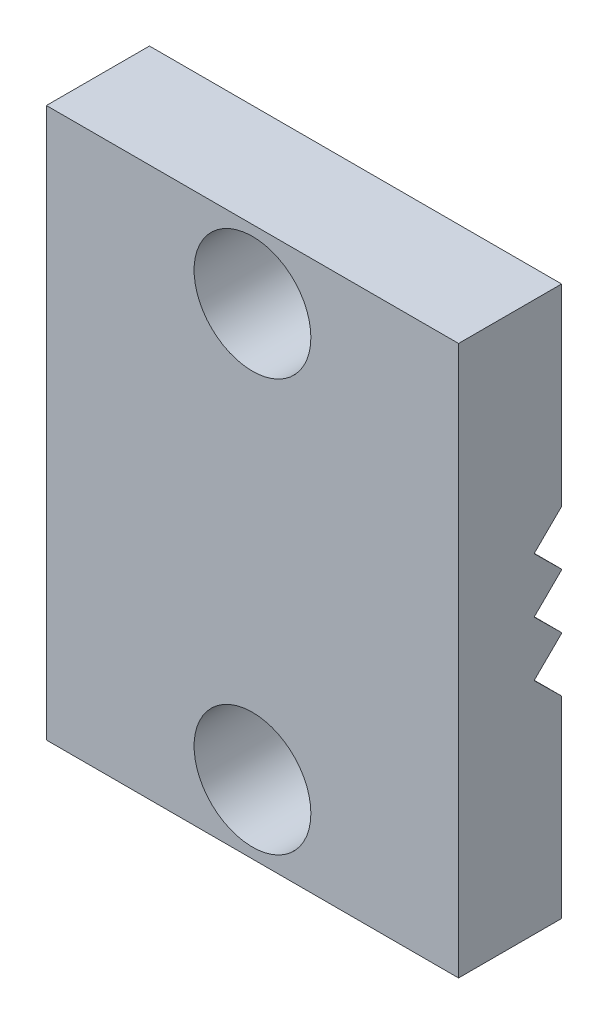
ISO-10303-21;
HEADER;
FILE_DESCRIPTION(('STEP AP214'),'2;1');
FILE_NAME('part.step','',(''),(''),'','','');
FILE_SCHEMA(('AUTOMOTIVE_DESIGN { 1 0 10303 214 1 1 1 1 }'));
ENDSEC;
DATA;
#1=APPLICATION_CONTEXT('core data for automotive mechanical design processes');
#2=APPLICATION_PROTOCOL_DEFINITION('international standard','automotive_design',2000,#1);
#3=PRODUCT_CONTEXT('',#1,'mechanical');
#4=PRODUCT('Part','Part','',(#3));
#5=PRODUCT_RELATED_PRODUCT_CATEGORY('part','',(#4));
#6=PRODUCT_DEFINITION_FORMATION('','',#4);
#7=PRODUCT_DEFINITION_CONTEXT('part definition',#1,'design');
#8=PRODUCT_DEFINITION('design','',#6,#7);
#9=PRODUCT_DEFINITION_SHAPE('','',#8);
#10=(LENGTH_UNIT() NAMED_UNIT(*) SI_UNIT(.MILLI.,.METRE.));
#11=(NAMED_UNIT(*) PLANE_ANGLE_UNIT() SI_UNIT($,.RADIAN.));
#12=(NAMED_UNIT(*) SI_UNIT($,.STERADIAN.) SOLID_ANGLE_UNIT());
#13=UNCERTAINTY_MEASURE_WITH_UNIT(LENGTH_MEASURE(1.E-05),#10,'distance_accuracy_value','');
#14=(GEOMETRIC_REPRESENTATION_CONTEXT(3) GLOBAL_UNCERTAINTY_ASSIGNED_CONTEXT((#13)) GLOBAL_UNIT_ASSIGNED_CONTEXT((#10,
#11,#12)) REPRESENTATION_CONTEXT('',''));
#15=CARTESIAN_POINT('',(0.,0.,0.));
#16=DIRECTION('',(0.,0.,1.));
#17=DIRECTION('',(1.,0.,0.));
#18=AXIS2_PLACEMENT_3D('',#15,#16,#17);
#19=CARTESIAN_POINT('',(40.,27.,125.));
#20=DIRECTION('',(0.,0.,1.));
#21=DIRECTION('',(1.,0.,0.));
#22=AXIS2_PLACEMENT_3D('',#19,#20,#21);
#23=CYLINDRICAL_SURFACE('',#22,1.7);
#24=DIRECTION('',(0.,0.,1.));
#25=VECTOR('',#24,1.);
#26=CARTESIAN_POINT('',(41.7,27.,125.));
#27=LINE('',#26,#25);
#28=CARTESIAN_POINT('',(41.7,27.,126.));
#29=VERTEX_POINT('',#28);
#30=CARTESIAN_POINT('',(41.7,27.,129.));
#31=VERTEX_POINT('',#30);
#32=EDGE_CURVE('E11',#29,#31,#27,.T.);
#33=ORIENTED_EDGE('',*,*,#32,.F.);
#34=CARTESIAN_POINT('',(40.,27.,126.));
#35=DIRECTION('',(0.,0.,1.));
#36=DIRECTION('',(1.,0.,0.));
#37=AXIS2_PLACEMENT_3D('',#34,#35,#36);
#38=CIRCLE('',#37,1.7);
#39=EDGE_CURVE('E101',#29,#29,#38,.T.);
#40=ORIENTED_EDGE('',*,*,#39,.F.);
#41=ORIENTED_EDGE('',*,*,#32,.T.);
#42=CARTESIAN_POINT('',(40.,27.,129.));
#43=DIRECTION('',(0.,0.,1.));
#44=DIRECTION('',(1.,0.,0.));
#45=AXIS2_PLACEMENT_3D('',#42,#43,#44);
#46=CIRCLE('',#45,1.7);
#47=EDGE_CURVE('E82',#31,#31,#46,.T.);
#48=ORIENTED_EDGE('',*,*,#47,.T.);
#49=EDGE_LOOP('',(#33,#40,#41,#48));
#50=FACE_BOUND('',#49,.T.);
#51=ADVANCED_FACE('F17',(#50),#23,.F.);
#52=CARTESIAN_POINT('',(40.,39.,125.));
#53=DIRECTION('',(0.,0.,1.));
#54=DIRECTION('',(1.,0.,0.));
#55=AXIS2_PLACEMENT_3D('',#52,#53,#54);
#56=CYLINDRICAL_SURFACE('',#55,1.7);
#57=DIRECTION('',(0.,0.,1.));
#58=VECTOR('',#57,1.);
#59=CARTESIAN_POINT('',(41.7,39.,125.));
#60=LINE('',#59,#58);
#61=CARTESIAN_POINT('',(41.7,39.,126.));
#62=VERTEX_POINT('',#61);
#63=CARTESIAN_POINT('',(41.7,39.,129.));
#64=VERTEX_POINT('',#63);
#65=EDGE_CURVE('E26',#62,#64,#60,.T.);
#66=ORIENTED_EDGE('',*,*,#65,.F.);
#67=CARTESIAN_POINT('',(40.,39.,126.));
#68=DIRECTION('',(0.,0.,1.));
#69=DIRECTION('',(1.,0.,0.));
#70=AXIS2_PLACEMENT_3D('',#67,#68,#69);
#71=CIRCLE('',#70,1.7);
#72=EDGE_CURVE('E190',#62,#62,#71,.T.);
#73=ORIENTED_EDGE('',*,*,#72,.F.);
#74=ORIENTED_EDGE('',*,*,#65,.T.);
#75=CARTESIAN_POINT('',(40.,39.,129.));
#76=DIRECTION('',(0.,0.,1.));
#77=DIRECTION('',(1.,0.,0.));
#78=AXIS2_PLACEMENT_3D('',#75,#76,#77);
#79=CIRCLE('',#78,1.7);
#80=EDGE_CURVE('E110',#64,#64,#79,.T.);
#81=ORIENTED_EDGE('',*,*,#80,.T.);
#82=EDGE_LOOP('',(#66,#73,#74,#81));
#83=FACE_BOUND('',#82,.T.);
#84=ADVANCED_FACE('F387',(#83),#56,.F.);
#85=CARTESIAN_POINT('',(46.,25.,126.));
#86=DIRECTION('',(1.,0.,0.));
#87=DIRECTION('',(0.,1.,0.));
#88=AXIS2_PLACEMENT_3D('',#85,#86,#87);
#89=PLANE('',#88);
#90=DIRECTION('',(0.,0.,1.));
#91=VECTOR('',#90,1.);
#92=CARTESIAN_POINT('',(46.,41.,126.));
#93=LINE('',#92,#91);
#94=CARTESIAN_POINT('',(46.,41.,126.));
#95=VERTEX_POINT('',#94);
#96=CARTESIAN_POINT('',(46.,41.,129.));
#97=VERTEX_POINT('',#96);
#98=EDGE_CURVE('E77',#95,#97,#93,.T.);
#99=ORIENTED_EDGE('',*,*,#98,.T.);
#100=DIRECTION('',(0.,1.,0.));
#101=VECTOR('',#100,1.);
#102=CARTESIAN_POINT('',(46.,25.,129.));
#103=LINE('',#102,#101);
#104=CARTESIAN_POINT('',(46.,25.,129.));
#105=VERTEX_POINT('',#104);
#106=EDGE_CURVE('E67',#105,#97,#103,.T.);
#107=ORIENTED_EDGE('',*,*,#106,.F.);
#108=DIRECTION('',(0.,0.,1.));
#109=VECTOR('',#108,1.);
#110=CARTESIAN_POINT('',(46.,25.,126.));
#111=LINE('',#110,#109);
#112=CARTESIAN_POINT('',(46.,25.,126.));
#113=VERTEX_POINT('',#112);
#114=EDGE_CURVE('E72',#113,#105,#111,.T.);
#115=ORIENTED_EDGE('',*,*,#114,.F.);
#116=DIRECTION('',(0.,1.,0.));
#117=VECTOR('',#116,1.);
#118=CARTESIAN_POINT('',(46.,25.,126.));
#119=LINE('',#118,#117);
#120=CARTESIAN_POINT('',(46.,30.60987654321,126.));
#121=VERTEX_POINT('',#120);
#122=EDGE_CURVE('E123',#113,#121,#119,.T.);
#123=ORIENTED_EDGE('',*,*,#122,.T.);
#124=DIRECTION('',(0.,-0.702701259061299,-0.711485024799303));
#125=VECTOR('',#124,1.);
#126=CARTESIAN_POINT('',(46.,29.219890440552,124.59263907105));
#127=LINE('',#126,#125);
#128=CARTESIAN_POINT('',(46.,31.4,126.8));
#129=VERTEX_POINT('',#128);
#130=EDGE_CURVE('E131',#129,#121,#127,.T.);
#131=ORIENTED_EDGE('',*,*,#130,.F.);
#132=DIRECTION('',(0.,-0.702701259061299,0.711485024799303));
#133=VECTOR('',#132,1.);
#134=CARTESIAN_POINT('',(46.,30.019859578736,128.19739217653));
#135=LINE('',#134,#133);
#136=CARTESIAN_POINT('',(46.,32.19012345679,126.));
#137=VERTEX_POINT('',#136);
#138=EDGE_CURVE('E141',#137,#129,#135,.T.);
#139=ORIENTED_EDGE('',*,*,#138,.F.);
#140=DIRECTION('',(0.,1.,0.));
#141=VECTOR('',#140,1.);
#142=CARTESIAN_POINT('',(46.,25.,126.));
#143=LINE('',#142,#141);
#144=CARTESIAN_POINT('',(46.,32.20987654321,126.));
#145=VERTEX_POINT('',#144);
#146=EDGE_CURVE('E152',#137,#145,#143,.T.);
#147=ORIENTED_EDGE('',*,*,#146,.T.);
#148=DIRECTION('',(0.,-0.702701259061299,-0.711485024799303));
#149=VECTOR('',#148,1.);
#150=CARTESIAN_POINT('',(46.,30.424859192964,124.19266993287));
#151=LINE('',#150,#149);
#152=CARTESIAN_POINT('',(46.,33.,126.8));
#153=VERTEX_POINT('',#152);
#154=EDGE_CURVE('E160',#153,#145,#151,.T.);
#155=ORIENTED_EDGE('',*,*,#154,.F.);
#156=DIRECTION('',(0.,-0.702701259061299,0.711485024799303));
#157=VECTOR('',#156,1.);
#158=CARTESIAN_POINT('',(46.,31.224828331147,128.59736131471));
#159=LINE('',#158,#157);
#160=CARTESIAN_POINT('',(46.,33.79012345679,126.));
#161=VERTEX_POINT('',#160);
#162=EDGE_CURVE('E168',#161,#153,#159,.T.);
#163=ORIENTED_EDGE('',*,*,#162,.F.);
#164=DIRECTION('',(0.,1.,0.));
#165=VECTOR('',#164,1.);
#166=CARTESIAN_POINT('',(46.,25.,126.));
#167=LINE('',#166,#165);
#168=CARTESIAN_POINT('',(46.,33.80987654321,126.));
#169=VERTEX_POINT('',#168);
#170=EDGE_CURVE('E176',#161,#169,#167,.T.);
#171=ORIENTED_EDGE('',*,*,#170,.T.);
#172=DIRECTION('',(0.,-0.702701259061299,-0.711485024799303));
#173=VECTOR('',#172,1.);
#174=CARTESIAN_POINT('',(46.,31.629827945375,123.79270079469));
#175=LINE('',#174,#173);
#176=CARTESIAN_POINT('',(46.,34.6,126.8));
#177=VERTEX_POINT('',#176);
#178=EDGE_CURVE('E181',#177,#169,#175,.T.);
#179=ORIENTED_EDGE('',*,*,#178,.F.);
#180=DIRECTION('',(0.,-0.702701259061299,0.711485024799303));
#181=VECTOR('',#180,1.);
#182=CARTESIAN_POINT('',(46.,32.429797083558,128.99733045289));
#183=LINE('',#182,#181);
#184=CARTESIAN_POINT('',(46.,35.39012345679,126.));
#185=VERTEX_POINT('',#184);
#186=EDGE_CURVE('E189',#185,#177,#183,.T.);
#187=ORIENTED_EDGE('',*,*,#186,.F.);
#188=DIRECTION('',(0.,1.,0.));
#189=VECTOR('',#188,1.);
#190=CARTESIAN_POINT('',(46.,25.,126.));
#191=LINE('',#190,#189);
#192=EDGE_CURVE('E198',#185,#95,#191,.T.);
#193=ORIENTED_EDGE('',*,*,#192,.T.);
#194=EDGE_LOOP('',(#99,#107,#115,#123,#131,#139,#147,#155,#163,#171,#179,#187,#193));
#195=FACE_BOUND('',#194,.T.);
#196=ADVANCED_FACE('F69',(#195),#89,.T.);
#197=CARTESIAN_POINT('',(34.,25.,129.));
#198=DIRECTION('',(0.,0.,1.));
#199=DIRECTION('',(1.,0.,0.));
#200=AXIS2_PLACEMENT_3D('',#197,#198,#199);
#201=PLANE('',#200);
#202=ORIENTED_EDGE('',*,*,#80,.F.);
#203=EDGE_LOOP('',(#202));
#204=FACE_BOUND('',#203,.T.);
#205=ORIENTED_EDGE('',*,*,#47,.F.);
#206=EDGE_LOOP('',(#205));
#207=FACE_BOUND('',#206,.T.);
#208=DIRECTION('',(0.,1.,0.));
#209=VECTOR('',#208,1.);
#210=CARTESIAN_POINT('',(34.,25.,129.));
#211=LINE('',#210,#209);
#212=CARTESIAN_POINT('',(34.,25.,129.));
#213=VERTEX_POINT('',#212);
#214=CARTESIAN_POINT('',(34.,41.,129.));
#215=VERTEX_POINT('',#214);
#216=EDGE_CURVE('E90',#213,#215,#211,.T.);
#217=ORIENTED_EDGE('',*,*,#216,.F.);
#218=DIRECTION('',(1.,0.,0.));
#219=VECTOR('',#218,1.);
#220=CARTESIAN_POINT('',(34.,25.,129.));
#221=LINE('',#220,#219);
#222=EDGE_CURVE('E83',#213,#105,#221,.T.);
#223=ORIENTED_EDGE('',*,*,#222,.T.);
#224=ORIENTED_EDGE('',*,*,#106,.T.);
#225=DIRECTION('',(1.,0.,0.));
#226=VECTOR('',#225,1.);
#227=CARTESIAN_POINT('',(34.,41.,129.));
#228=LINE('',#227,#226);
#229=EDGE_CURVE('E200',#215,#97,#228,.T.);
#230=ORIENTED_EDGE('',*,*,#229,.F.);
#231=EDGE_LOOP('',(#217,#223,#224,#230));
#232=FACE_BOUND('',#231,.T.);
#233=ADVANCED_FACE('F87',(#204,#207,#232),#201,.T.);
#234=CARTESIAN_POINT('',(34.,25.,126.));
#235=DIRECTION('',(0.,1.,0.));
#236=DIRECTION('',(1.,0.,0.));
#237=AXIS2_PLACEMENT_3D('',#234,#235,#236);
#238=PLANE('',#237);
#239=ORIENTED_EDGE('',*,*,#114,.T.);
#240=ORIENTED_EDGE('',*,*,#222,.F.);
#241=DIRECTION('',(0.,0.,1.));
#242=VECTOR('',#241,1.);
#243=CARTESIAN_POINT('',(34.,25.,126.));
#244=LINE('',#243,#242);
#245=CARTESIAN_POINT('',(34.,25.,126.));
#246=VERTEX_POINT('',#245);
#247=EDGE_CURVE('E208',#246,#213,#244,.T.);
#248=ORIENTED_EDGE('',*,*,#247,.F.);
#249=DIRECTION('',(1.,0.,0.));
#250=VECTOR('',#249,1.);
#251=CARTESIAN_POINT('',(34.,25.,126.));
#252=LINE('',#251,#250);
#253=EDGE_CURVE('E98',#246,#113,#252,.T.);
#254=ORIENTED_EDGE('',*,*,#253,.T.);
#255=EDGE_LOOP('',(#239,#240,#248,#254));
#256=FACE_BOUND('',#255,.T.);
#257=ADVANCED_FACE('F96',(#256),#238,.F.);
#258=CARTESIAN_POINT('',(34.,25.,126.));
#259=DIRECTION('',(0.,0.,1.));
#260=DIRECTION('',(1.,0.,0.));
#261=AXIS2_PLACEMENT_3D('',#258,#259,#260);
#262=PLANE('',#261);
#263=ORIENTED_EDGE('',*,*,#39,.T.);
#264=EDGE_LOOP('',(#263));
#265=FACE_BOUND('',#264,.T.);
#266=DIRECTION('',(1.,0.,0.));
#267=VECTOR('',#266,1.);
#268=CARTESIAN_POINT('',(33.5,30.60987654321,126.));
#269=LINE('',#268,#267);
#270=CARTESIAN_POINT('',(34.,30.60987654321,126.));
#271=VERTEX_POINT('',#270);
#272=EDGE_CURVE('E126',#271,#121,#269,.T.);
#273=ORIENTED_EDGE('',*,*,#272,.T.);
#274=ORIENTED_EDGE('',*,*,#122,.F.);
#275=ORIENTED_EDGE('',*,*,#253,.F.);
#276=DIRECTION('',(0.,1.,0.));
#277=VECTOR('',#276,1.);
#278=CARTESIAN_POINT('',(34.,25.,126.));
#279=LINE('',#278,#277);
#280=EDGE_CURVE('E214',#246,#271,#279,.T.);
#281=ORIENTED_EDGE('',*,*,#280,.T.);
#282=EDGE_LOOP('',(#273,#274,#275,#281));
#283=FACE_BOUND('',#282,.T.);
#284=ADVANCED_FACE('F266',(#265,#283),#262,.F.);
#285=CARTESIAN_POINT('',(33.,30.6,125.99));
#286=DIRECTION('',(0.,-0.711485024799303,0.702701259061299));
#287=DIRECTION('',(-1.,0.,0.));
#288=AXIS2_PLACEMENT_3D('',#285,#286,#287);
#289=PLANE('',#288);
#290=ORIENTED_EDGE('',*,*,#130,.T.);
#291=ORIENTED_EDGE('',*,*,#272,.F.);
#292=DIRECTION('',(0.,-0.702701259061299,-0.711485024799303));
#293=VECTOR('',#292,1.);
#294=CARTESIAN_POINT('',(34.,29.219890440552,124.59263907105));
#295=LINE('',#294,#293);
#296=CARTESIAN_POINT('',(34.,31.4,126.8));
#297=VERTEX_POINT('',#296);
#298=EDGE_CURVE('E215',#297,#271,#295,.T.);
#299=ORIENTED_EDGE('',*,*,#298,.F.);
#300=DIRECTION('',(1.,0.,0.));
#301=VECTOR('',#300,1.);
#302=CARTESIAN_POINT('',(33.,31.4,126.8));
#303=LINE('',#302,#301);
#304=EDGE_CURVE('E138',#297,#129,#303,.T.);
#305=ORIENTED_EDGE('',*,*,#304,.T.);
#306=EDGE_LOOP('',(#290,#291,#299,#305));
#307=FACE_BOUND('',#306,.T.);
#308=ADVANCED_FACE('F278',(#307),#289,.F.);
#309=CARTESIAN_POINT('',(33.,31.4,126.8));
#310=DIRECTION('',(0.,0.711485024799303,0.702701259061299));
#311=DIRECTION('',(1.,0.,0.));
#312=AXIS2_PLACEMENT_3D('',#309,#310,#311);
#313=PLANE('',#312);
#314=DIRECTION('',(-1.,0.,0.));
#315=VECTOR('',#314,1.);
#316=CARTESIAN_POINT('',(33.5,32.19012345679,126.));
#317=LINE('',#316,#315);
#318=CARTESIAN_POINT('',(34.,32.19012345679,126.));
#319=VERTEX_POINT('',#318);
#320=EDGE_CURVE('E145',#137,#319,#317,.T.);
#321=ORIENTED_EDGE('',*,*,#320,.F.);
#322=ORIENTED_EDGE('',*,*,#138,.T.);
#323=ORIENTED_EDGE('',*,*,#304,.F.);
#324=DIRECTION('',(0.,-0.702701259061299,0.711485024799303));
#325=VECTOR('',#324,1.);
#326=CARTESIAN_POINT('',(34.,30.019859578736,128.19739217653));
#327=LINE('',#326,#325);
#328=EDGE_CURVE('E219',#319,#297,#327,.T.);
#329=ORIENTED_EDGE('',*,*,#328,.F.);
#330=EDGE_LOOP('',(#321,#322,#323,#329));
#331=FACE_BOUND('',#330,.T.);
#332=ADVANCED_FACE('F422',(#331),#313,.F.);
#333=CARTESIAN_POINT('',(34.,25.,126.));
#334=DIRECTION('',(0.,0.,1.));
#335=DIRECTION('',(1.,0.,0.));
#336=AXIS2_PLACEMENT_3D('',#333,#334,#335);
#337=PLANE('',#336);
#338=DIRECTION('',(1.,0.,0.));
#339=VECTOR('',#338,1.);
#340=CARTESIAN_POINT('',(33.5,32.20987654321,126.));
#341=LINE('',#340,#339);
#342=CARTESIAN_POINT('',(34.,32.20987654321,126.));
#343=VERTEX_POINT('',#342);
#344=EDGE_CURVE('E156',#343,#145,#341,.T.);
#345=ORIENTED_EDGE('',*,*,#344,.T.);
#346=ORIENTED_EDGE('',*,*,#146,.F.);
#347=ORIENTED_EDGE('',*,*,#320,.T.);
#348=DIRECTION('',(0.,1.,0.));
#349=VECTOR('',#348,1.);
#350=CARTESIAN_POINT('',(34.,25.,126.));
#351=LINE('',#350,#349);
#352=EDGE_CURVE('E225',#319,#343,#351,.T.);
#353=ORIENTED_EDGE('',*,*,#352,.T.);
#354=EDGE_LOOP('',(#345,#346,#347,#353));
#355=FACE_BOUND('',#354,.T.);
#356=ADVANCED_FACE('F372',(#355),#337,.F.);
#357=CARTESIAN_POINT('',(33.,32.2,125.99));
#358=DIRECTION('',(0.,-0.711485024799303,0.702701259061299));
#359=DIRECTION('',(-1.,0.,0.));
#360=AXIS2_PLACEMENT_3D('',#357,#358,#359);
#361=PLANE('',#360);
#362=ORIENTED_EDGE('',*,*,#154,.T.);
#363=ORIENTED_EDGE('',*,*,#344,.F.);
#364=DIRECTION('',(0.,-0.702701259061299,-0.711485024799303));
#365=VECTOR('',#364,1.);
#366=CARTESIAN_POINT('',(34.,30.424859192964,124.19266993287));
#367=LINE('',#366,#365);
#368=CARTESIAN_POINT('',(34.,33.,126.8));
#369=VERTEX_POINT('',#368);
#370=EDGE_CURVE('E235',#369,#343,#367,.T.);
#371=ORIENTED_EDGE('',*,*,#370,.F.);
#372=DIRECTION('',(1.,0.,0.));
#373=VECTOR('',#372,1.);
#374=CARTESIAN_POINT('',(33.,33.,126.8));
#375=LINE('',#374,#373);
#376=EDGE_CURVE('E164',#369,#153,#375,.T.);
#377=ORIENTED_EDGE('',*,*,#376,.T.);
#378=EDGE_LOOP('',(#362,#363,#371,#377));
#379=FACE_BOUND('',#378,.T.);
#380=ADVANCED_FACE('F369',(#379),#361,.F.);
#381=CARTESIAN_POINT('',(33.,33.,126.8));
#382=DIRECTION('',(0.,0.711485024799303,0.702701259061299));
#383=DIRECTION('',(1.,0.,0.));
#384=AXIS2_PLACEMENT_3D('',#381,#382,#383);
#385=PLANE('',#384);
#386=DIRECTION('',(-1.,0.,0.));
#387=VECTOR('',#386,1.);
#388=CARTESIAN_POINT('',(33.5,33.79012345679,126.));
#389=LINE('',#388,#387);
#390=CARTESIAN_POINT('',(34.,33.79012345679,126.));
#391=VERTEX_POINT('',#390);
#392=EDGE_CURVE('E172',#161,#391,#389,.T.);
#393=ORIENTED_EDGE('',*,*,#392,.F.);
#394=ORIENTED_EDGE('',*,*,#162,.T.);
#395=ORIENTED_EDGE('',*,*,#376,.F.);
#396=DIRECTION('',(0.,-0.702701259061299,0.711485024799303));
#397=VECTOR('',#396,1.);
#398=CARTESIAN_POINT('',(34.,31.224828331147,128.59736131471));
#399=LINE('',#398,#397);
#400=EDGE_CURVE('E239',#391,#369,#399,.T.);
#401=ORIENTED_EDGE('',*,*,#400,.F.);
#402=EDGE_LOOP('',(#393,#394,#395,#401));
#403=FACE_BOUND('',#402,.T.);
#404=ADVANCED_FACE('F319',(#403),#385,.F.);
#405=CARTESIAN_POINT('',(34.,25.,126.));
#406=DIRECTION('',(0.,0.,1.));
#407=DIRECTION('',(1.,0.,0.));
#408=AXIS2_PLACEMENT_3D('',#405,#406,#407);
#409=PLANE('',#408);
#410=DIRECTION('',(1.,0.,0.));
#411=VECTOR('',#410,1.);
#412=CARTESIAN_POINT('',(33.5,33.80987654321,126.));
#413=LINE('',#412,#411);
#414=CARTESIAN_POINT('',(34.,33.80987654321,126.));
#415=VERTEX_POINT('',#414);
#416=EDGE_CURVE('E177',#415,#169,#413,.T.);
#417=ORIENTED_EDGE('',*,*,#416,.T.);
#418=ORIENTED_EDGE('',*,*,#170,.F.);
#419=ORIENTED_EDGE('',*,*,#392,.T.);
#420=DIRECTION('',(0.,1.,0.));
#421=VECTOR('',#420,1.);
#422=CARTESIAN_POINT('',(34.,25.,126.));
#423=LINE('',#422,#421);
#424=EDGE_CURVE('E240',#391,#415,#423,.T.);
#425=ORIENTED_EDGE('',*,*,#424,.T.);
#426=EDGE_LOOP('',(#417,#418,#419,#425));
#427=FACE_BOUND('',#426,.T.);
#428=ADVANCED_FACE('F323',(#427),#409,.F.);
#429=CARTESIAN_POINT('',(33.,33.8,125.99));
#430=DIRECTION('',(0.,-0.711485024799303,0.702701259061299));
#431=DIRECTION('',(-1.,0.,0.));
#432=AXIS2_PLACEMENT_3D('',#429,#430,#431);
#433=PLANE('',#432);
#434=ORIENTED_EDGE('',*,*,#178,.T.);
#435=ORIENTED_EDGE('',*,*,#416,.F.);
#436=DIRECTION('',(0.,-0.702701259061299,-0.711485024799303));
#437=VECTOR('',#436,1.);
#438=CARTESIAN_POINT('',(34.,31.629827945375,123.79270079469));
#439=LINE('',#438,#437);
#440=CARTESIAN_POINT('',(34.,34.6,126.8));
#441=VERTEX_POINT('',#440);
#442=EDGE_CURVE('E244',#441,#415,#439,.T.);
#443=ORIENTED_EDGE('',*,*,#442,.F.);
#444=DIRECTION('',(1.,0.,0.));
#445=VECTOR('',#444,1.);
#446=CARTESIAN_POINT('',(33.,34.6,126.8));
#447=LINE('',#446,#445);
#448=EDGE_CURVE('E185',#441,#177,#447,.T.);
#449=ORIENTED_EDGE('',*,*,#448,.T.);
#450=EDGE_LOOP('',(#434,#435,#443,#449));
#451=FACE_BOUND('',#450,.T.);
#452=ADVANCED_FACE('F328',(#451),#433,.F.);
#453=CARTESIAN_POINT('',(33.,34.6,126.8));
#454=DIRECTION('',(0.,0.711485024799303,0.702701259061299));
#455=DIRECTION('',(1.,0.,0.));
#456=AXIS2_PLACEMENT_3D('',#453,#454,#455);
#457=PLANE('',#456);
#458=DIRECTION('',(-1.,0.,0.));
#459=VECTOR('',#458,1.);
#460=CARTESIAN_POINT('',(33.5,35.39012345679,126.));
#461=LINE('',#460,#459);
#462=CARTESIAN_POINT('',(34.,35.39012345679,126.));
#463=VERTEX_POINT('',#462);
#464=EDGE_CURVE('E194',#185,#463,#461,.T.);
#465=ORIENTED_EDGE('',*,*,#464,.F.);
#466=ORIENTED_EDGE('',*,*,#186,.T.);
#467=ORIENTED_EDGE('',*,*,#448,.F.);
#468=DIRECTION('',(0.,-0.702701259061299,0.711485024799303));
#469=VECTOR('',#468,1.);
#470=CARTESIAN_POINT('',(34.,32.429797083558,128.99733045289));
#471=LINE('',#470,#469);
#472=EDGE_CURVE('E248',#463,#441,#471,.T.);
#473=ORIENTED_EDGE('',*,*,#472,.F.);
#474=EDGE_LOOP('',(#465,#466,#467,#473));
#475=FACE_BOUND('',#474,.T.);
#476=ADVANCED_FACE('F337',(#475),#457,.F.);
#477=CARTESIAN_POINT('',(34.,25.,126.));
#478=DIRECTION('',(0.,0.,1.));
#479=DIRECTION('',(1.,0.,0.));
#480=AXIS2_PLACEMENT_3D('',#477,#478,#479);
#481=PLANE('',#480);
#482=ORIENTED_EDGE('',*,*,#72,.T.);
#483=EDGE_LOOP('',(#482));
#484=FACE_BOUND('',#483,.T.);
#485=DIRECTION('',(1.,0.,0.));
#486=VECTOR('',#485,1.);
#487=CARTESIAN_POINT('',(34.,41.,126.));
#488=LINE('',#487,#486);
#489=CARTESIAN_POINT('',(34.,41.,126.));
#490=VERTEX_POINT('',#489);
#491=EDGE_CURVE('E204',#490,#95,#488,.T.);
#492=ORIENTED_EDGE('',*,*,#491,.T.);
#493=ORIENTED_EDGE('',*,*,#192,.F.);
#494=ORIENTED_EDGE('',*,*,#464,.T.);
#495=DIRECTION('',(0.,1.,0.));
#496=VECTOR('',#495,1.);
#497=CARTESIAN_POINT('',(34.,25.,126.));
#498=LINE('',#497,#496);
#499=EDGE_CURVE('E255',#463,#490,#498,.T.);
#500=ORIENTED_EDGE('',*,*,#499,.T.);
#501=EDGE_LOOP('',(#492,#493,#494,#500));
#502=FACE_BOUND('',#501,.T.);
#503=ADVANCED_FACE('F340',(#484,#502),#481,.F.);
#504=CARTESIAN_POINT('',(34.,41.,126.));
#505=DIRECTION('',(0.,1.,0.));
#506=DIRECTION('',(1.,0.,0.));
#507=AXIS2_PLACEMENT_3D('',#504,#505,#506);
#508=PLANE('',#507);
#509=ORIENTED_EDGE('',*,*,#491,.F.);
#510=DIRECTION('',(0.,0.,1.));
#511=VECTOR('',#510,1.);
#512=CARTESIAN_POINT('',(34.,41.,126.));
#513=LINE('',#512,#511);
#514=EDGE_CURVE('E207',#490,#215,#513,.T.);
#515=ORIENTED_EDGE('',*,*,#514,.T.);
#516=ORIENTED_EDGE('',*,*,#229,.T.);
#517=ORIENTED_EDGE('',*,*,#98,.F.);
#518=EDGE_LOOP('',(#509,#515,#516,#517));
#519=FACE_BOUND('',#518,.T.);
#520=ADVANCED_FACE('F345',(#519),#508,.T.);
#521=CARTESIAN_POINT('',(34.,25.,126.));
#522=DIRECTION('',(1.,0.,0.));
#523=DIRECTION('',(0.,1.,0.));
#524=AXIS2_PLACEMENT_3D('',#521,#522,#523);
#525=PLANE('',#524);
#526=ORIENTED_EDGE('',*,*,#499,.F.);
#527=ORIENTED_EDGE('',*,*,#472,.T.);
#528=ORIENTED_EDGE('',*,*,#442,.T.);
#529=ORIENTED_EDGE('',*,*,#424,.F.);
#530=ORIENTED_EDGE('',*,*,#400,.T.);
#531=ORIENTED_EDGE('',*,*,#370,.T.);
#532=ORIENTED_EDGE('',*,*,#352,.F.);
#533=ORIENTED_EDGE('',*,*,#328,.T.);
#534=ORIENTED_EDGE('',*,*,#298,.T.);
#535=ORIENTED_EDGE('',*,*,#280,.F.);
#536=ORIENTED_EDGE('',*,*,#247,.T.);
#537=ORIENTED_EDGE('',*,*,#216,.T.);
#538=ORIENTED_EDGE('',*,*,#514,.F.);
#539=EDGE_LOOP('',(#526,#527,#528,#529,#530,#531,#532,#533,#534,#535,#536,#537,#538));
#540=FACE_BOUND('',#539,.T.);
#541=ADVANCED_FACE('F274',(#540),#525,.F.);
#542=CLOSED_SHELL('',(#51,#84,#196,#233,#257,#284,#308,#332,#356,#380,#404,#428,#452,#476,#503,
#520,#541));
#543=MANIFOLD_SOLID_BREP('B1',#542);
#544=ADVANCED_BREP_SHAPE_REPRESENTATION('',(#18,#543),#14);
#545=SHAPE_DEFINITION_REPRESENTATION(#9,#544);
ENDSEC;
END-ISO-10303-21;
